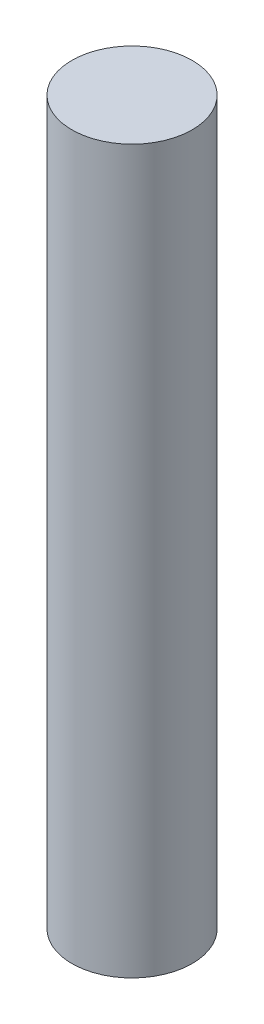
ISO-10303-21;
HEADER;
FILE_DESCRIPTION(('STEP AP214'),'2;1');
FILE_NAME('part.step','',(''),(''),'','','');
FILE_SCHEMA(('AUTOMOTIVE_DESIGN { 1 0 10303 214 1 1 1 1 }'));
ENDSEC;
DATA;
#1=APPLICATION_CONTEXT('core data for automotive mechanical design processes');
#2=APPLICATION_PROTOCOL_DEFINITION('international standard','automotive_design',2000,#1);
#3=PRODUCT_CONTEXT('',#1,'mechanical');
#4=PRODUCT('Part','Part','',(#3));
#5=PRODUCT_RELATED_PRODUCT_CATEGORY('part','',(#4));
#6=PRODUCT_DEFINITION_FORMATION('','',#4);
#7=PRODUCT_DEFINITION_CONTEXT('part definition',#1,'design');
#8=PRODUCT_DEFINITION('design','',#6,#7);
#9=PRODUCT_DEFINITION_SHAPE('','',#8);
#10=(LENGTH_UNIT() NAMED_UNIT(*) SI_UNIT(.MILLI.,.METRE.));
#11=(NAMED_UNIT(*) PLANE_ANGLE_UNIT() SI_UNIT($,.RADIAN.));
#12=(NAMED_UNIT(*) SI_UNIT($,.STERADIAN.) SOLID_ANGLE_UNIT());
#13=UNCERTAINTY_MEASURE_WITH_UNIT(LENGTH_MEASURE(1.E-05),#10,'distance_accuracy_value','');
#14=(GEOMETRIC_REPRESENTATION_CONTEXT(3) GLOBAL_UNCERTAINTY_ASSIGNED_CONTEXT((#13)) GLOBAL_UNIT_ASSIGNED_CONTEXT((#10,
#11,#12)) REPRESENTATION_CONTEXT('',''));
#15=CARTESIAN_POINT('',(0.,0.,0.));
#16=DIRECTION('',(0.,0.,1.));
#17=DIRECTION('',(1.,0.,0.));
#18=AXIS2_PLACEMENT_3D('',#15,#16,#17);
#19=CARTESIAN_POINT('',(0.,152.4,0.));
#20=DIRECTION('',(0.,-1.,0.));
#21=DIRECTION('',(0.,0.,-1.));
#22=AXIS2_PLACEMENT_3D('',#19,#20,#21);
#23=CYLINDRICAL_SURFACE('',#22,12.7);
#24=CARTESIAN_POINT('',(0.,152.4,0.));
#25=DIRECTION('',(0.,1.,0.));
#26=DIRECTION('',(0.,0.,1.));
#27=AXIS2_PLACEMENT_3D('',#24,#25,#26);
#28=CIRCLE('',#27,12.7);
#29=CARTESIAN_POINT('',(0.,152.4,-12.7));
#30=VERTEX_POINT('',#29);
#31=EDGE_CURVE('E10',#30,#30,#28,.T.);
#32=CARTESIAN_POINT('',(0.,0.,0.));
#33=DIRECTION('',(0.,1.,0.));
#34=DIRECTION('',(0.,0.,1.));
#35=AXIS2_PLACEMENT_3D('',#32,#33,#34);
#36=CIRCLE('',#35,12.7);
#37=CARTESIAN_POINT('',(0.,0.,-12.7));
#38=VERTEX_POINT('',#37);
#39=EDGE_CURVE('E46',#38,#38,#36,.T.);
#40=CARTESIAN_POINT('',(0.,152.4,-12.7));
#41=CARTESIAN_POINT('',(0.,150.8125,-12.7));
#42=CARTESIAN_POINT('',(0.,149.225,-12.7));
#43=CARTESIAN_POINT('',(0.,146.05,-12.7));
#44=CARTESIAN_POINT('',(0.,144.4625,-12.7));
#45=CARTESIAN_POINT('',(0.,141.2875,-12.7));
#46=CARTESIAN_POINT('',(0.,139.7,-12.7));
#47=CARTESIAN_POINT('',(0.,136.525,-12.7));
#48=CARTESIAN_POINT('',(0.,134.9375,-12.7));
#49=CARTESIAN_POINT('',(0.,131.7625,-12.7));
#50=CARTESIAN_POINT('',(0.,130.175,-12.7));
#51=CARTESIAN_POINT('',(0.,127.,-12.7));
#52=CARTESIAN_POINT('',(0.,125.4125,-12.7));
#53=CARTESIAN_POINT('',(0.,122.2375,-12.7));
#54=CARTESIAN_POINT('',(0.,120.65,-12.7));
#55=CARTESIAN_POINT('',(0.,117.475,-12.7));
#56=CARTESIAN_POINT('',(0.,115.8875,-12.7));
#57=CARTESIAN_POINT('',(0.,112.7125,-12.7));
#58=CARTESIAN_POINT('',(0.,111.125,-12.7));
#59=CARTESIAN_POINT('',(0.,107.95,-12.7));
#60=CARTESIAN_POINT('',(0.,106.3625,-12.7));
#61=CARTESIAN_POINT('',(0.,103.1875,-12.7));
#62=CARTESIAN_POINT('',(0.,101.6,-12.7));
#63=CARTESIAN_POINT('',(0.,98.425,-12.7));
#64=CARTESIAN_POINT('',(0.,96.8375,-12.7));
#65=CARTESIAN_POINT('',(0.,93.6625,-12.7));
#66=CARTESIAN_POINT('',(0.,92.075,-12.7));
#67=CARTESIAN_POINT('',(0.,88.9,-12.7));
#68=CARTESIAN_POINT('',(0.,87.3125,-12.7));
#69=CARTESIAN_POINT('',(0.,84.1375,-12.7));
#70=CARTESIAN_POINT('',(0.,82.55,-12.7));
#71=CARTESIAN_POINT('',(0.,79.375,-12.7));
#72=CARTESIAN_POINT('',(0.,77.7875,-12.7));
#73=CARTESIAN_POINT('',(0.,74.6125,-12.7));
#74=CARTESIAN_POINT('',(0.,73.025,-12.7));
#75=CARTESIAN_POINT('',(0.,69.85,-12.7));
#76=CARTESIAN_POINT('',(0.,68.2625,-12.7));
#77=CARTESIAN_POINT('',(0.,65.0875,-12.7));
#78=CARTESIAN_POINT('',(0.,63.5,-12.7));
#79=CARTESIAN_POINT('',(0.,60.325,-12.7));
#80=CARTESIAN_POINT('',(0.,58.7375,-12.7));
#81=CARTESIAN_POINT('',(0.,55.5625,-12.7));
#82=CARTESIAN_POINT('',(0.,53.975,-12.7));
#83=CARTESIAN_POINT('',(0.,50.8,-12.7));
#84=CARTESIAN_POINT('',(0.,49.2125,-12.7));
#85=CARTESIAN_POINT('',(0.,46.0375,-12.7));
#86=CARTESIAN_POINT('',(0.,44.45,-12.7));
#87=CARTESIAN_POINT('',(0.,41.275,-12.7));
#88=CARTESIAN_POINT('',(0.,39.6875,-12.7));
#89=CARTESIAN_POINT('',(0.,36.5125,-12.7));
#90=CARTESIAN_POINT('',(0.,34.925,-12.7));
#91=CARTESIAN_POINT('',(0.,31.75,-12.7));
#92=CARTESIAN_POINT('',(0.,30.1625,-12.7));
#93=CARTESIAN_POINT('',(0.,26.9875,-12.7));
#94=CARTESIAN_POINT('',(0.,25.4,-12.7));
#95=CARTESIAN_POINT('',(0.,22.225,-12.7));
#96=CARTESIAN_POINT('',(0.,20.6375,-12.7));
#97=CARTESIAN_POINT('',(0.,17.4625,-12.7));
#98=CARTESIAN_POINT('',(0.,15.875,-12.7));
#99=CARTESIAN_POINT('',(0.,12.7,-12.7));
#100=CARTESIAN_POINT('',(0.,11.1125,-12.7));
#101=CARTESIAN_POINT('',(0.,7.93750000000001,-12.7));
#102=CARTESIAN_POINT('',(0.,6.35,-12.7));
#103=CARTESIAN_POINT('',(0.,3.175,-12.7));
#104=CARTESIAN_POINT('',(0.,1.5875,-12.7));
#105=CARTESIAN_POINT('',(0.,0.,-12.7));
#106=B_SPLINE_CURVE_WITH_KNOTS('',3,(#40,#41,#42,#43,#44,#45,#46,#47,#48,#49,#50,#51,#52,#53,
#54,#55,#56,#57,#58,#59,#60,#61,#62,#63,#64,#65,#66,#67,#68,#69,#70,#71,#72,#73,#74,#75,#76,#77,
#78,#79,#80,#81,#82,#83,#84,#85,#86,#87,#88,#89,#90,#91,#92,#93,#94,#95,#96,#97,#98,#99,#100,
#101,#102,#103,#104,#105),.UNSPECIFIED.,.F.,.F.,(4,2,2,2,2,2,2,2,2,2,2,2,2,2,2,2,2,2,2,2,2,2,2,
2,2,2,2,2,2,2,2,2,4),(0.,4.76249999999998,9.52499999999998,14.2875,19.05,23.8125,28.575,33.3375,
38.1,42.8625,47.625,52.3875,57.15,61.9125,66.675,71.4375,76.2,80.9625,85.725,90.4875,95.25,
100.0125,104.775,109.5375,114.3,119.0625,123.825,128.5875,133.35,138.1125,142.875,147.6375,
152.4),.UNSPECIFIED.);
#107=EDGE_CURVE('BSEAM43',#30,#38,#106,.T.);
#108=ORIENTED_EDGE('',*,*,#31,.F.);
#109=ORIENTED_EDGE('',*,*,#39,.T.);
#110=ORIENTED_EDGE('',*,*,#107,.T.);
#111=ORIENTED_EDGE('',*,*,#107,.F.);
#112=EDGE_LOOP('',(#108,#110,#109,#111));
#113=FACE_BOUND('',#112,.T.);
#114=ADVANCED_FACE('F43',(#113),#23,.T.);
#115=CARTESIAN_POINT('',(0.,152.4,0.));
#116=DIRECTION('',(0.,1.,0.));
#117=DIRECTION('',(0.,0.,1.));
#118=AXIS2_PLACEMENT_3D('',#115,#116,#117);
#119=PLANE('',#118);
#120=ORIENTED_EDGE('',*,*,#31,.T.);
#121=EDGE_LOOP('',(#120));
#122=FACE_BOUND('',#121,.T.);
#123=ADVANCED_FACE('F60',(#122),#119,.T.);
#124=CARTESIAN_POINT('',(0.,0.,0.));
#125=DIRECTION('',(0.,1.,0.));
#126=DIRECTION('',(0.,0.,1.));
#127=AXIS2_PLACEMENT_3D('',#124,#125,#126);
#128=PLANE('',#127);
#129=ORIENTED_EDGE('',*,*,#39,.F.);
#130=EDGE_LOOP('',(#129));
#131=FACE_BOUND('',#130,.T.);
#132=ADVANCED_FACE('F58',(#131),#128,.F.);
#133=CLOSED_SHELL('',(#114,#123,#132));
#134=MANIFOLD_SOLID_BREP('B2',#133);
#135=ADVANCED_BREP_SHAPE_REPRESENTATION('',(#18,#134),#14);
#136=SHAPE_DEFINITION_REPRESENTATION(#9,#135);
ENDSEC;
END-ISO-10303-21;
